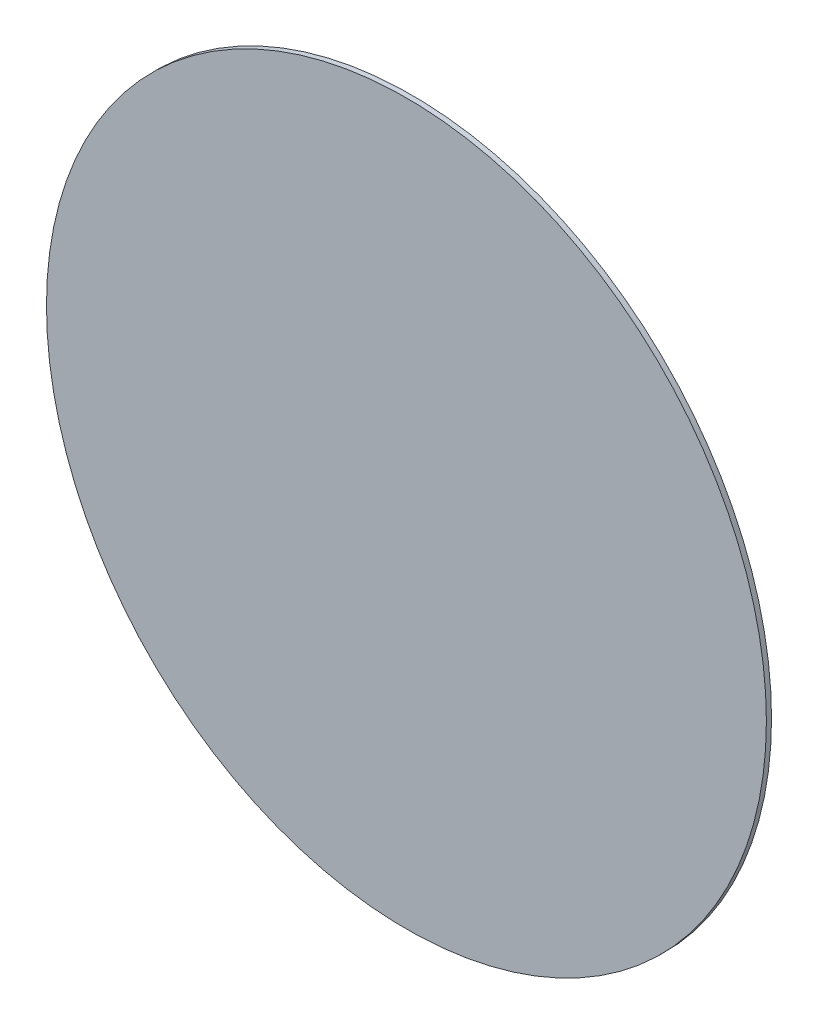
ISO-10303-21;
HEADER;
FILE_DESCRIPTION(('STEP AP214'),'2;1');
FILE_NAME('part.step','',(''),(''),'','','');
FILE_SCHEMA(('AUTOMOTIVE_DESIGN { 1 0 10303 214 1 1 1 1 }'));
ENDSEC;
DATA;
#1=APPLICATION_CONTEXT('core data for automotive mechanical design processes');
#2=APPLICATION_PROTOCOL_DEFINITION('international standard','automotive_design',2000,#1);
#3=PRODUCT_CONTEXT('',#1,'mechanical');
#4=PRODUCT('Part','Part','',(#3));
#5=PRODUCT_RELATED_PRODUCT_CATEGORY('part','',(#4));
#6=PRODUCT_DEFINITION_FORMATION('','',#4);
#7=PRODUCT_DEFINITION_CONTEXT('part definition',#1,'design');
#8=PRODUCT_DEFINITION('design','',#6,#7);
#9=PRODUCT_DEFINITION_SHAPE('','',#8);
#10=(LENGTH_UNIT() NAMED_UNIT(*) SI_UNIT(.MILLI.,.METRE.));
#11=(NAMED_UNIT(*) PLANE_ANGLE_UNIT() SI_UNIT($,.RADIAN.));
#12=(NAMED_UNIT(*) SI_UNIT($,.STERADIAN.) SOLID_ANGLE_UNIT());
#13=UNCERTAINTY_MEASURE_WITH_UNIT(LENGTH_MEASURE(1.E-05),#10,'distance_accuracy_value','');
#14=(GEOMETRIC_REPRESENTATION_CONTEXT(3) GLOBAL_UNCERTAINTY_ASSIGNED_CONTEXT((#13)) GLOBAL_UNIT_ASSIGNED_CONTEXT((#10,
#11,#12)) REPRESENTATION_CONTEXT('',''));
#15=CARTESIAN_POINT('',(0.,0.,0.));
#16=DIRECTION('',(0.,0.,1.));
#17=DIRECTION('',(1.,0.,0.));
#18=AXIS2_PLACEMENT_3D('',#15,#16,#17);
#19=CARTESIAN_POINT('',(0.,0.,2.54));
#20=DIRECTION('',(0.,0.,-1.));
#21=DIRECTION('',(-1.,0.,0.));
#22=AXIS2_PLACEMENT_3D('',#19,#20,#21);
#23=CYLINDRICAL_SURFACE('',#22,177.8);
#24=CARTESIAN_POINT('',(0.,0.,2.54));
#25=DIRECTION('',(0.,0.,1.));
#26=DIRECTION('',(1.,0.,0.));
#27=AXIS2_PLACEMENT_3D('',#24,#25,#26);
#28=CIRCLE('',#27,177.8);
#29=CARTESIAN_POINT('',(177.8,0.,2.54));
#30=VERTEX_POINT('',#29);
#31=EDGE_CURVE('E10',#30,#30,#28,.T.);
#32=ORIENTED_EDGE('',*,*,#31,.F.);
#33=EDGE_LOOP('',(#32));
#34=FACE_BOUND('',#33,.T.);
#35=CARTESIAN_POINT('',(0.,0.,0.));
#36=DIRECTION('',(0.,0.,1.));
#37=DIRECTION('',(1.,0.,0.));
#38=AXIS2_PLACEMENT_3D('',#35,#36,#37);
#39=CIRCLE('',#38,177.8);
#40=CARTESIAN_POINT('',(177.8,0.,0.));
#41=VERTEX_POINT('',#40);
#42=EDGE_CURVE('E46',#41,#41,#39,.T.);
#43=ORIENTED_EDGE('',*,*,#42,.T.);
#44=EDGE_LOOP('',(#43));
#45=FACE_BOUND('',#44,.T.);
#46=ADVANCED_FACE('F43',(#34,#45),#23,.T.);
#47=CARTESIAN_POINT('',(0.,0.,2.54));
#48=DIRECTION('',(0.,0.,1.));
#49=DIRECTION('',(1.,0.,0.));
#50=AXIS2_PLACEMENT_3D('',#47,#48,#49);
#51=PLANE('',#50);
#52=ORIENTED_EDGE('',*,*,#31,.T.);
#53=EDGE_LOOP('',(#52));
#54=FACE_BOUND('',#53,.T.);
#55=ADVANCED_FACE('F60',(#54),#51,.T.);
#56=CARTESIAN_POINT('',(0.,0.,0.));
#57=DIRECTION('',(0.,0.,1.));
#58=DIRECTION('',(1.,0.,0.));
#59=AXIS2_PLACEMENT_3D('',#56,#57,#58);
#60=PLANE('',#59);
#61=ORIENTED_EDGE('',*,*,#42,.F.);
#62=EDGE_LOOP('',(#61));
#63=FACE_BOUND('',#62,.T.);
#64=ADVANCED_FACE('F58',(#63),#60,.F.);
#65=CLOSED_SHELL('',(#46,#55,#64));
#66=MANIFOLD_SOLID_BREP('B2',#65);
#67=ADVANCED_BREP_SHAPE_REPRESENTATION('',(#18,#66),#14);
#68=SHAPE_DEFINITION_REPRESENTATION(#9,#67);
ENDSEC;
END-ISO-10303-21;
